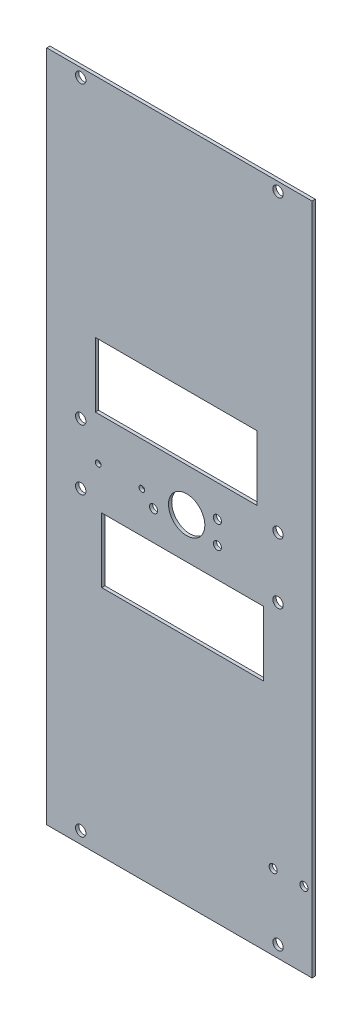
ISO-10303-21;
HEADER;
FILE_DESCRIPTION(('STEP AP214'),'2;1');
FILE_NAME('part.step','',(''),(''),'','','');
FILE_SCHEMA(('AUTOMOTIVE_DESIGN { 1 0 10303 214 1 1 1 1 }'));
ENDSEC;
DATA;
#1=APPLICATION_CONTEXT('core data for automotive mechanical design processes');
#2=APPLICATION_PROTOCOL_DEFINITION('international standard','automotive_design',2000,#1);
#3=PRODUCT_CONTEXT('',#1,'mechanical');
#4=PRODUCT('Part','Part','',(#3));
#5=PRODUCT_RELATED_PRODUCT_CATEGORY('part','',(#4));
#6=PRODUCT_DEFINITION_FORMATION('','',#4);
#7=PRODUCT_DEFINITION_CONTEXT('part definition',#1,'design');
#8=PRODUCT_DEFINITION('design','',#6,#7);
#9=PRODUCT_DEFINITION_SHAPE('','',#8);
#10=(LENGTH_UNIT() NAMED_UNIT(*) SI_UNIT(.MILLI.,.METRE.));
#11=(NAMED_UNIT(*) PLANE_ANGLE_UNIT() SI_UNIT($,.RADIAN.));
#12=(NAMED_UNIT(*) SI_UNIT($,.STERADIAN.) SOLID_ANGLE_UNIT());
#13=UNCERTAINTY_MEASURE_WITH_UNIT(LENGTH_MEASURE(1.E-05),#10,'distance_accuracy_value','');
#14=(GEOMETRIC_REPRESENTATION_CONTEXT(3) GLOBAL_UNCERTAINTY_ASSIGNED_CONTEXT((#13)) GLOBAL_UNIT_ASSIGNED_CONTEXT((#10,
#11,#12)) REPRESENTATION_CONTEXT('',''));
#15=CARTESIAN_POINT('',(0.,0.,0.));
#16=DIRECTION('',(0.,0.,1.));
#17=DIRECTION('',(1.,0.,0.));
#18=AXIS2_PLACEMENT_3D('',#15,#16,#17);
#19=CARTESIAN_POINT('',(-41.,-104.,1.));
#20=DIRECTION('',(1.,0.,0.));
#21=DIRECTION('',(0.,0.,-1.));
#22=AXIS2_PLACEMENT_3D('',#19,#20,#21);
#23=PLANE('',#22);
#24=DIRECTION('',(0.,-1.,0.));
#25=VECTOR('',#24,1.);
#26=CARTESIAN_POINT('',(-41.,-104.,0.));
#27=LINE('',#26,#25);
#28=CARTESIAN_POINT('',(-41.,104.,0.));
#29=VERTEX_POINT('',#28);
#30=CARTESIAN_POINT('',(-41.,-104.,0.));
#31=VERTEX_POINT('',#30);
#32=EDGE_CURVE('E235',#29,#31,#27,.T.);
#33=ORIENTED_EDGE('',*,*,#32,.T.);
#34=DIRECTION('',(0.,0.,-1.));
#35=VECTOR('',#34,1.);
#36=CARTESIAN_POINT('',(-41.,-104.,1.));
#37=LINE('',#36,#35);
#38=CARTESIAN_POINT('',(-41.,-104.,1.));
#39=VERTEX_POINT('',#38);
#40=EDGE_CURVE('E11',#39,#31,#37,.T.);
#41=ORIENTED_EDGE('',*,*,#40,.F.);
#42=DIRECTION('',(0.,-1.,0.));
#43=VECTOR('',#42,1.);
#44=CARTESIAN_POINT('',(-41.,-104.,1.));
#45=LINE('',#44,#43);
#46=CARTESIAN_POINT('',(-41.,104.,1.));
#47=VERTEX_POINT('',#46);
#48=EDGE_CURVE('E236',#47,#39,#45,.T.);
#49=ORIENTED_EDGE('',*,*,#48,.F.);
#50=DIRECTION('',(0.,0.,-1.));
#51=VECTOR('',#50,1.);
#52=CARTESIAN_POINT('',(-41.,104.,1.));
#53=LINE('',#52,#51);
#54=EDGE_CURVE('E246',#47,#29,#53,.T.);
#55=ORIENTED_EDGE('',*,*,#54,.T.);
#56=EDGE_LOOP('',(#33,#41,#49,#55));
#57=FACE_BOUND('',#56,.T.);
#58=ADVANCED_FACE('F33',(#57),#23,.F.);
#59=CARTESIAN_POINT('',(41.,-104.,1.));
#60=DIRECTION('',(0.,1.,0.));
#61=DIRECTION('',(-1.,0.,0.));
#62=AXIS2_PLACEMENT_3D('',#59,#60,#61);
#63=PLANE('',#62);
#64=DIRECTION('',(1.,0.,0.));
#65=VECTOR('',#64,1.);
#66=CARTESIAN_POINT('',(41.,-104.,0.));
#67=LINE('',#66,#65);
#68=CARTESIAN_POINT('',(41.,-104.,0.));
#69=VERTEX_POINT('',#68);
#70=EDGE_CURVE('E249',#31,#69,#67,.T.);
#71=ORIENTED_EDGE('',*,*,#70,.T.);
#72=DIRECTION('',(0.,0.,-1.));
#73=VECTOR('',#72,1.);
#74=CARTESIAN_POINT('',(41.,-104.,1.));
#75=LINE('',#74,#73);
#76=CARTESIAN_POINT('',(41.,-104.,1.));
#77=VERTEX_POINT('',#76);
#78=EDGE_CURVE('E41',#77,#69,#75,.T.);
#79=ORIENTED_EDGE('',*,*,#78,.F.);
#80=DIRECTION('',(1.,0.,0.));
#81=VECTOR('',#80,1.);
#82=CARTESIAN_POINT('',(41.,-104.,1.));
#83=LINE('',#82,#81);
#84=EDGE_CURVE('E239',#39,#77,#83,.T.);
#85=ORIENTED_EDGE('',*,*,#84,.F.);
#86=ORIENTED_EDGE('',*,*,#40,.T.);
#87=EDGE_LOOP('',(#71,#79,#85,#86));
#88=FACE_BOUND('',#87,.T.);
#89=ADVANCED_FACE('F333',(#88),#63,.F.);
#90=CARTESIAN_POINT('',(41.,-104.,1.));
#91=DIRECTION('',(-1.,0.,0.));
#92=DIRECTION('',(0.,0.,1.));
#93=AXIS2_PLACEMENT_3D('',#90,#91,#92);
#94=PLANE('',#93);
#95=DIRECTION('',(0.,1.,0.));
#96=VECTOR('',#95,1.);
#97=CARTESIAN_POINT('',(41.,-104.,0.));
#98=LINE('',#97,#96);
#99=CARTESIAN_POINT('',(41.,104.,0.));
#100=VERTEX_POINT('',#99);
#101=EDGE_CURVE('E251',#69,#100,#98,.T.);
#102=ORIENTED_EDGE('',*,*,#101,.T.);
#103=DIRECTION('',(0.,0.,-1.));
#104=VECTOR('',#103,1.);
#105=CARTESIAN_POINT('',(41.,104.,1.));
#106=LINE('',#105,#104);
#107=CARTESIAN_POINT('',(41.,104.,1.));
#108=VERTEX_POINT('',#107);
#109=EDGE_CURVE('E256',#108,#100,#106,.T.);
#110=ORIENTED_EDGE('',*,*,#109,.F.);
#111=DIRECTION('',(0.,1.,0.));
#112=VECTOR('',#111,1.);
#113=CARTESIAN_POINT('',(41.,-104.,1.));
#114=LINE('',#113,#112);
#115=EDGE_CURVE('E242',#77,#108,#114,.T.);
#116=ORIENTED_EDGE('',*,*,#115,.F.);
#117=ORIENTED_EDGE('',*,*,#78,.T.);
#118=EDGE_LOOP('',(#102,#110,#116,#117));
#119=FACE_BOUND('',#118,.T.);
#120=ADVANCED_FACE('F338',(#119),#94,.F.);
#121=CARTESIAN_POINT('',(41.,104.,1.));
#122=DIRECTION('',(0.,-1.,0.));
#123=DIRECTION('',(0.,0.,-1.));
#124=AXIS2_PLACEMENT_3D('',#121,#122,#123);
#125=PLANE('',#124);
#126=DIRECTION('',(-1.,0.,0.));
#127=VECTOR('',#126,1.);
#128=CARTESIAN_POINT('',(41.,104.,0.));
#129=LINE('',#128,#127);
#130=EDGE_CURVE('E240',#100,#29,#129,.T.);
#131=ORIENTED_EDGE('',*,*,#130,.T.);
#132=ORIENTED_EDGE('',*,*,#54,.F.);
#133=DIRECTION('',(-1.,0.,0.));
#134=VECTOR('',#133,1.);
#135=CARTESIAN_POINT('',(41.,104.,1.));
#136=LINE('',#135,#134);
#137=EDGE_CURVE('E244',#108,#47,#136,.T.);
#138=ORIENTED_EDGE('',*,*,#137,.F.);
#139=ORIENTED_EDGE('',*,*,#109,.T.);
#140=EDGE_LOOP('',(#131,#132,#138,#139));
#141=FACE_BOUND('',#140,.T.);
#142=ADVANCED_FACE('F326',(#141),#125,.F.);
#143=CARTESIAN_POINT('',(0.,0.,1.));
#144=DIRECTION('',(0.,0.,1.));
#145=DIRECTION('',(1.,0.,0.));
#146=AXIS2_PLACEMENT_3D('',#143,#144,#145);
#147=PLANE('',#146);
#148=CARTESIAN_POINT('',(2.25,0.650001220002142,0.999999999999999));
#149=DIRECTION('',(0.,0.,1.));
#150=DIRECTION('',(1.,0.,0.));
#151=AXIS2_PLACEMENT_3D('',#148,#149,#150);
#152=CIRCLE('',#151,5.61483876415166);
#153=CARTESIAN_POINT('',(7.86483876415166,0.650001220002142,0.999999999999999));
#154=VERTEX_POINT('',#153);
#155=EDGE_CURVE('E678',#154,#154,#152,.T.);
#156=ORIENTED_EDGE('',*,*,#155,.F.);
#157=EDGE_LOOP('',(#156));
#158=FACE_BOUND('',#157,.T.);
#159=CARTESIAN_POINT('',(11.75,4.15000122000214,1.));
#160=DIRECTION('',(0.,0.,1.));
#161=DIRECTION('',(1.,0.,0.));
#162=AXIS2_PLACEMENT_3D('',#159,#160,#161);
#163=CIRCLE('',#162,1.25);
#164=CARTESIAN_POINT('',(13.,4.15000122000214,1.));
#165=VERTEX_POINT('',#164);
#166=EDGE_CURVE('E277',#165,#165,#163,.T.);
#167=ORIENTED_EDGE('',*,*,#166,.F.);
#168=EDGE_LOOP('',(#167));
#169=FACE_BOUND('',#168,.T.);
#170=CARTESIAN_POINT('',(11.75,-2.84999877999786,1.));
#171=DIRECTION('',(0.,0.,1.));
#172=DIRECTION('',(1.,0.,0.));
#173=AXIS2_PLACEMENT_3D('',#170,#171,#172);
#174=CIRCLE('',#173,1.25);
#175=CARTESIAN_POINT('',(13.,-2.84999877999786,1.));
#176=VERTEX_POINT('',#175);
#177=EDGE_CURVE('E267',#176,#176,#174,.T.);
#178=ORIENTED_EDGE('',*,*,#177,.F.);
#179=EDGE_LOOP('',(#178));
#180=FACE_BOUND('',#179,.T.);
#181=CARTESIAN_POINT('',(-8.,-2.84999877999786,1.));
#182=DIRECTION('',(0.,0.,1.));
#183=DIRECTION('',(1.,0.,0.));
#184=AXIS2_PLACEMENT_3D('',#181,#182,#183);
#185=CIRCLE('',#184,1.25);
#186=CARTESIAN_POINT('',(-6.75,-2.84999877999786,1.));
#187=VERTEX_POINT('',#186);
#188=EDGE_CURVE('E264',#187,#187,#185,.T.);
#189=ORIENTED_EDGE('',*,*,#188,.F.);
#190=EDGE_LOOP('',(#189));
#191=FACE_BOUND('',#190,.T.);
#192=CARTESIAN_POINT('',(-25.1,0.650000000002136,1.));
#193=DIRECTION('',(0.,0.,1.));
#194=DIRECTION('',(1.,0.,0.));
#195=AXIS2_PLACEMENT_3D('',#192,#193,#194);
#196=CIRCLE('',#195,0.874999999999987);
#197=CARTESIAN_POINT('',(-24.225,0.650000000002136,1.));
#198=VERTEX_POINT('',#197);
#199=EDGE_CURVE('E263',#198,#198,#196,.T.);
#200=ORIENTED_EDGE('',*,*,#199,.F.);
#201=EDGE_LOOP('',(#200));
#202=FACE_BOUND('',#201,.T.);
#203=CARTESIAN_POINT('',(-11.6,0.650000000002136,1.));
#204=DIRECTION('',(0.,0.,1.));
#205=DIRECTION('',(1.,0.,0.));
#206=AXIS2_PLACEMENT_3D('',#203,#204,#205);
#207=CIRCLE('',#206,0.874999999999987);
#208=CARTESIAN_POINT('',(-10.725,0.650000000002136,1.));
#209=VERTEX_POINT('',#208);
#210=EDGE_CURVE('E286',#209,#209,#207,.T.);
#211=ORIENTED_EDGE('',*,*,#210,.F.);
#212=EDGE_LOOP('',(#211));
#213=FACE_BOUND('',#212,.T.);
#214=CARTESIAN_POINT('',(28.9999999999999,-80.7027961734741,1.));
#215=DIRECTION('',(0.,0.,-1.));
#216=DIRECTION('',(-1.,0.,0.));
#217=AXIS2_PLACEMENT_3D('',#214,#215,#216);
#218=CIRCLE('',#217,1.25);
#219=CARTESIAN_POINT('',(27.7499999999999,-80.7027961734741,1.));
#220=VERTEX_POINT('',#219);
#221=EDGE_CURVE('E295',#220,#220,#218,.T.);
#222=ORIENTED_EDGE('',*,*,#221,.T.);
#223=EDGE_LOOP('',(#222));
#224=FACE_BOUND('',#223,.T.);
#225=CARTESIAN_POINT('',(38.4999999999998,-80.7027961734741,1.));
#226=DIRECTION('',(0.,0.,-1.));
#227=DIRECTION('',(-1.,0.,0.));
#228=AXIS2_PLACEMENT_3D('',#225,#226,#227);
#229=CIRCLE('',#228,1.25);
#230=CARTESIAN_POINT('',(37.2499999999998,-80.7027961734741,1.));
#231=VERTEX_POINT('',#230);
#232=EDGE_CURVE('E301',#231,#231,#229,.T.);
#233=ORIENTED_EDGE('',*,*,#232,.T.);
#234=EDGE_LOOP('',(#233));
#235=FACE_BOUND('',#234,.T.);
#236=DIRECTION('',(0.,1.,0.));
#237=VECTOR('',#236,1.);
#238=CARTESIAN_POINT('',(24.,0.,1.));
#239=LINE('',#238,#237);
#240=CARTESIAN_POINT('',(24.,14.,0.999999999999999));
#241=VERTEX_POINT('',#240);
#242=CARTESIAN_POINT('',(24.,34.,0.999999999999999));
#243=VERTEX_POINT('',#242);
#244=EDGE_CURVE('E156',#241,#243,#239,.T.);
#245=ORIENTED_EDGE('',*,*,#244,.F.);
#246=DIRECTION('',(1.,0.,0.));
#247=VECTOR('',#246,1.);
#248=CARTESIAN_POINT('',(0.,14.,1.));
#249=LINE('',#248,#247);
#250=CARTESIAN_POINT('',(-26.,14.,1.));
#251=VERTEX_POINT('',#250);
#252=EDGE_CURVE('E149',#251,#241,#249,.T.);
#253=ORIENTED_EDGE('',*,*,#252,.F.);
#254=DIRECTION('',(0.,-1.,0.));
#255=VECTOR('',#254,1.);
#256=CARTESIAN_POINT('',(-26.,0.,1.));
#257=LINE('',#256,#255);
#258=CARTESIAN_POINT('',(-26.,34.,0.999999999999999));
#259=VERTEX_POINT('',#258);
#260=EDGE_CURVE('E129',#259,#251,#257,.T.);
#261=ORIENTED_EDGE('',*,*,#260,.F.);
#262=DIRECTION('',(-1.,0.,0.));
#263=VECTOR('',#262,1.);
#264=CARTESIAN_POINT('',(0.,34.,1.));
#265=LINE('',#264,#263);
#266=EDGE_CURVE('E154',#243,#259,#265,.T.);
#267=ORIENTED_EDGE('',*,*,#266,.F.);
#268=EDGE_LOOP('',(#245,#253,#261,#267));
#269=FACE_BOUND('',#268,.T.);
#270=DIRECTION('',(0.,-1.,0.));
#271=VECTOR('',#270,1.);
#272=CARTESIAN_POINT('',(-24.,0.,1.));
#273=LINE('',#272,#271);
#274=CARTESIAN_POINT('',(-24.,-12.,0.999999999999999));
#275=VERTEX_POINT('',#274);
#276=CARTESIAN_POINT('',(-24.,-32.,0.999999999999999));
#277=VERTEX_POINT('',#276);
#278=EDGE_CURVE('E185',#275,#277,#273,.T.);
#279=ORIENTED_EDGE('',*,*,#278,.F.);
#280=DIRECTION('',(-1.,0.,0.));
#281=VECTOR('',#280,1.);
#282=CARTESIAN_POINT('',(0.,-12.,1.));
#283=LINE('',#282,#281);
#284=CARTESIAN_POINT('',(26.,-12.,1.));
#285=VERTEX_POINT('',#284);
#286=EDGE_CURVE('E172',#285,#275,#283,.T.);
#287=ORIENTED_EDGE('',*,*,#286,.F.);
#288=DIRECTION('',(0.,1.,0.));
#289=VECTOR('',#288,1.);
#290=CARTESIAN_POINT('',(26.,0.,1.));
#291=LINE('',#290,#289);
#292=CARTESIAN_POINT('',(26.,-32.,0.999999999999999));
#293=VERTEX_POINT('',#292);
#294=EDGE_CURVE('E180',#293,#285,#291,.T.);
#295=ORIENTED_EDGE('',*,*,#294,.F.);
#296=DIRECTION('',(1.,0.,0.));
#297=VECTOR('',#296,1.);
#298=CARTESIAN_POINT('',(0.,-32.,1.));
#299=LINE('',#298,#297);
#300=EDGE_CURVE('E183',#277,#293,#299,.T.);
#301=ORIENTED_EDGE('',*,*,#300,.F.);
#302=EDGE_LOOP('',(#279,#287,#295,#301));
#303=FACE_BOUND('',#302,.T.);
#304=CARTESIAN_POINT('',(-30.4999999999936,9.99999999999958,1.));
#305=DIRECTION('',(0.,0.,1.));
#306=DIRECTION('',(1.,0.,0.));
#307=AXIS2_PLACEMENT_3D('',#304,#305,#306);
#308=CIRCLE('',#307,1.6);
#309=CARTESIAN_POINT('',(-28.8999999999936,9.99999999999958,1.));
#310=VERTEX_POINT('',#309);
#311=EDGE_CURVE('E187',#310,#310,#308,.T.);
#312=ORIENTED_EDGE('',*,*,#311,.F.);
#313=EDGE_LOOP('',(#312));
#314=FACE_BOUND('',#313,.T.);
#315=CARTESIAN_POINT('',(30.5000000000064,9.99999999999983,1.));
#316=DIRECTION('',(0.,0.,1.));
#317=DIRECTION('',(1.,0.,0.));
#318=AXIS2_PLACEMENT_3D('',#315,#316,#317);
#319=CIRCLE('',#318,1.6);
#320=CARTESIAN_POINT('',(32.1000000000064,9.99999999999983,1.));
#321=VERTEX_POINT('',#320);
#322=EDGE_CURVE('E193',#321,#321,#319,.T.);
#323=ORIENTED_EDGE('',*,*,#322,.F.);
#324=EDGE_LOOP('',(#323));
#325=FACE_BOUND('',#324,.T.);
#326=CARTESIAN_POINT('',(30.4999974600213,-100.299999679998,1.));
#327=DIRECTION('',(0.,0.,1.));
#328=DIRECTION('',(1.,0.,0.));
#329=AXIS2_PLACEMENT_3D('',#326,#327,#328);
#330=CIRCLE('',#329,1.6);
#331=CARTESIAN_POINT('',(32.0999974600213,-100.299999679998,1.));
#332=VERTEX_POINT('',#331);
#333=EDGE_CURVE('E199',#332,#332,#330,.T.);
#334=ORIENTED_EDGE('',*,*,#333,.F.);
#335=EDGE_LOOP('',(#334));
#336=FACE_BOUND('',#335,.T.);
#337=CARTESIAN_POINT('',(-30.5000024599787,-100.299999679998,1.));
#338=DIRECTION('',(0.,0.,1.));
#339=DIRECTION('',(1.,0.,0.));
#340=AXIS2_PLACEMENT_3D('',#337,#338,#339);
#341=CIRCLE('',#340,1.6);
#342=CARTESIAN_POINT('',(-28.9000024599787,-100.299999679998,1.));
#343=VERTEX_POINT('',#342);
#344=EDGE_CURVE('E205',#343,#343,#341,.T.);
#345=ORIENTED_EDGE('',*,*,#344,.F.);
#346=EDGE_LOOP('',(#345));
#347=FACE_BOUND('',#346,.T.);
#348=CARTESIAN_POINT('',(-30.4999999999793,101.300000000002,1.));
#349=DIRECTION('',(0.,0.,1.));
#350=DIRECTION('',(1.,0.,0.));
#351=AXIS2_PLACEMENT_3D('',#348,#349,#350);
#352=CIRCLE('',#351,1.6);
#353=CARTESIAN_POINT('',(-28.8999999999793,101.300000000002,1.));
#354=VERTEX_POINT('',#353);
#355=EDGE_CURVE('E211',#354,#354,#352,.T.);
#356=ORIENTED_EDGE('',*,*,#355,.F.);
#357=EDGE_LOOP('',(#356));
#358=FACE_BOUND('',#357,.T.);
#359=CARTESIAN_POINT('',(30.5000000000207,101.300000000003,1.));
#360=DIRECTION('',(0.,0.,1.));
#361=DIRECTION('',(1.,0.,0.));
#362=AXIS2_PLACEMENT_3D('',#359,#360,#361);
#363=CIRCLE('',#362,1.6);
#364=CARTESIAN_POINT('',(32.1000000000207,101.300000000003,1.));
#365=VERTEX_POINT('',#364);
#366=EDGE_CURVE('E217',#365,#365,#363,.T.);
#367=ORIENTED_EDGE('',*,*,#366,.F.);
#368=EDGE_LOOP('',(#367));
#369=FACE_BOUND('',#368,.T.);
#370=CARTESIAN_POINT('',(30.4999974600213,-8.69999999999785,1.));
#371=DIRECTION('',(0.,0.,1.));
#372=DIRECTION('',(1.,0.,0.));
#373=AXIS2_PLACEMENT_3D('',#370,#371,#372);
#374=CIRCLE('',#373,1.6);
#375=CARTESIAN_POINT('',(32.0999974600213,-8.69999999999785,1.));
#376=VERTEX_POINT('',#375);
#377=EDGE_CURVE('E223',#376,#376,#374,.T.);
#378=ORIENTED_EDGE('',*,*,#377,.F.);
#379=EDGE_LOOP('',(#378));
#380=FACE_BOUND('',#379,.T.);
#381=CARTESIAN_POINT('',(-30.5000024599787,-8.69999999999784,1.));
#382=DIRECTION('',(0.,0.,1.));
#383=DIRECTION('',(1.,0.,0.));
#384=AXIS2_PLACEMENT_3D('',#381,#382,#383);
#385=CIRCLE('',#384,1.6);
#386=CARTESIAN_POINT('',(-28.9000024599787,-8.69999999999784,1.));
#387=VERTEX_POINT('',#386);
#388=EDGE_CURVE('E229',#387,#387,#385,.T.);
#389=ORIENTED_EDGE('',*,*,#388,.F.);
#390=EDGE_LOOP('',(#389));
#391=FACE_BOUND('',#390,.T.);
#392=ORIENTED_EDGE('',*,*,#48,.T.);
#393=ORIENTED_EDGE('',*,*,#84,.T.);
#394=ORIENTED_EDGE('',*,*,#115,.T.);
#395=ORIENTED_EDGE('',*,*,#137,.T.);
#396=EDGE_LOOP('',(#392,#393,#394,#395));
#397=FACE_BOUND('',#396,.T.);
#398=ADVANCED_FACE('F305',(#158,#169,#180,#191,#202,#213,#224,#235,#269,#303,#314,#325,#336,
#347,#358,#369,#380,#391,#397),#147,.T.);
#399=CARTESIAN_POINT('',(0.,0.,0.));
#400=DIRECTION('',(0.,0.,1.));
#401=DIRECTION('',(1.,0.,0.));
#402=AXIS2_PLACEMENT_3D('',#399,#400,#401);
#403=PLANE('',#402);
#404=CARTESIAN_POINT('',(2.25,0.650001220002142,0.));
#405=DIRECTION('',(0.,0.,-1.));
#406=DIRECTION('',(-1.,0.,0.));
#407=AXIS2_PLACEMENT_3D('',#404,#405,#406);
#408=CIRCLE('',#407,5.61483876415166);
#409=CARTESIAN_POINT('',(-3.36483876415166,0.650001220002142,0.));
#410=VERTEX_POINT('',#409);
#411=EDGE_CURVE('E680',#410,#410,#408,.T.);
#412=ORIENTED_EDGE('',*,*,#411,.F.);
#413=EDGE_LOOP('',(#412));
#414=FACE_BOUND('',#413,.T.);
#415=CARTESIAN_POINT('',(11.75,4.15000122000214,0.));
#416=DIRECTION('',(0.,0.,1.));
#417=DIRECTION('',(1.,0.,0.));
#418=AXIS2_PLACEMENT_3D('',#415,#416,#417);
#419=CIRCLE('',#418,1.25);
#420=CARTESIAN_POINT('',(13.,4.15000122000214,0.));
#421=VERTEX_POINT('',#420);
#422=EDGE_CURVE('E36',#421,#421,#419,.T.);
#423=ORIENTED_EDGE('',*,*,#422,.T.);
#424=EDGE_LOOP('',(#423));
#425=FACE_BOUND('',#424,.T.);
#426=CARTESIAN_POINT('',(11.75,-2.84999877999786,0.));
#427=DIRECTION('',(0.,0.,1.));
#428=DIRECTION('',(1.,0.,0.));
#429=AXIS2_PLACEMENT_3D('',#426,#427,#428);
#430=CIRCLE('',#429,1.25);
#431=CARTESIAN_POINT('',(13.,-2.84999877999786,0.));
#432=VERTEX_POINT('',#431);
#433=EDGE_CURVE('E265',#432,#432,#430,.T.);
#434=ORIENTED_EDGE('',*,*,#433,.T.);
#435=EDGE_LOOP('',(#434));
#436=FACE_BOUND('',#435,.T.);
#437=CARTESIAN_POINT('',(-8.,-2.84999877999786,0.));
#438=DIRECTION('',(0.,0.,1.));
#439=DIRECTION('',(1.,0.,0.));
#440=AXIS2_PLACEMENT_3D('',#437,#438,#439);
#441=CIRCLE('',#440,1.25);
#442=CARTESIAN_POINT('',(-6.75,-2.84999877999786,0.));
#443=VERTEX_POINT('',#442);
#444=EDGE_CURVE('E261',#443,#443,#441,.T.);
#445=ORIENTED_EDGE('',*,*,#444,.T.);
#446=EDGE_LOOP('',(#445));
#447=FACE_BOUND('',#446,.T.);
#448=CARTESIAN_POINT('',(-25.1,0.650000000002136,0.));
#449=DIRECTION('',(0.,0.,1.));
#450=DIRECTION('',(1.,0.,0.));
#451=AXIS2_PLACEMENT_3D('',#448,#449,#450);
#452=CIRCLE('',#451,0.874999999999997);
#453=CARTESIAN_POINT('',(-24.225,0.650000000002136,0.));
#454=VERTEX_POINT('',#453);
#455=EDGE_CURVE('E283',#454,#454,#452,.T.);
#456=ORIENTED_EDGE('',*,*,#455,.T.);
#457=EDGE_LOOP('',(#456));
#458=FACE_BOUND('',#457,.T.);
#459=CARTESIAN_POINT('',(-11.6,0.650000000002136,0.));
#460=DIRECTION('',(0.,0.,1.));
#461=DIRECTION('',(1.,0.,0.));
#462=AXIS2_PLACEMENT_3D('',#459,#460,#461);
#463=CIRCLE('',#462,0.874999999999999);
#464=CARTESIAN_POINT('',(-10.725,0.650000000002136,0.));
#465=VERTEX_POINT('',#464);
#466=EDGE_CURVE('E289',#465,#465,#463,.T.);
#467=ORIENTED_EDGE('',*,*,#466,.T.);
#468=EDGE_LOOP('',(#467));
#469=FACE_BOUND('',#468,.T.);
#470=CARTESIAN_POINT('',(28.9999999999999,-80.7027961734741,0.));
#471=DIRECTION('',(0.,0.,-1.));
#472=DIRECTION('',(-1.,0.,0.));
#473=AXIS2_PLACEMENT_3D('',#470,#471,#472);
#474=CIRCLE('',#473,1.25);
#475=CARTESIAN_POINT('',(27.7499999999999,-80.7027961734741,0.));
#476=VERTEX_POINT('',#475);
#477=EDGE_CURVE('E292',#476,#476,#474,.T.);
#478=ORIENTED_EDGE('',*,*,#477,.F.);
#479=EDGE_LOOP('',(#478));
#480=FACE_BOUND('',#479,.T.);
#481=CARTESIAN_POINT('',(38.4999999999998,-80.7027961734741,0.));
#482=DIRECTION('',(0.,0.,-1.));
#483=DIRECTION('',(-1.,0.,0.));
#484=AXIS2_PLACEMENT_3D('',#481,#482,#483);
#485=CIRCLE('',#484,1.25);
#486=CARTESIAN_POINT('',(37.2499999999998,-80.7027961734741,0.));
#487=VERTEX_POINT('',#486);
#488=EDGE_CURVE('E298',#487,#487,#485,.T.);
#489=ORIENTED_EDGE('',*,*,#488,.F.);
#490=EDGE_LOOP('',(#489));
#491=FACE_BOUND('',#490,.T.);
#492=DIRECTION('',(-1.,0.,0.));
#493=VECTOR('',#492,1.);
#494=CARTESIAN_POINT('',(24.,14.,0.));
#495=LINE('',#494,#493);
#496=CARTESIAN_POINT('',(24.,14.,0.));
#497=VERTEX_POINT('',#496);
#498=CARTESIAN_POINT('',(-26.,14.,0.));
#499=VERTEX_POINT('',#498);
#500=EDGE_CURVE('E135',#497,#499,#495,.T.);
#501=ORIENTED_EDGE('',*,*,#500,.F.);
#502=DIRECTION('',(0.,-1.,0.));
#503=VECTOR('',#502,1.);
#504=CARTESIAN_POINT('',(24.,14.,0.));
#505=LINE('',#504,#503);
#506=CARTESIAN_POINT('',(24.,34.,0.));
#507=VERTEX_POINT('',#506);
#508=EDGE_CURVE('E57',#507,#497,#505,.T.);
#509=ORIENTED_EDGE('',*,*,#508,.F.);
#510=DIRECTION('',(1.,0.,0.));
#511=VECTOR('',#510,1.);
#512=CARTESIAN_POINT('',(24.,34.,0.));
#513=LINE('',#512,#511);
#514=CARTESIAN_POINT('',(-26.,34.,0.));
#515=VERTEX_POINT('',#514);
#516=EDGE_CURVE('E142',#515,#507,#513,.T.);
#517=ORIENTED_EDGE('',*,*,#516,.F.);
#518=DIRECTION('',(0.,1.,0.));
#519=VECTOR('',#518,1.);
#520=CARTESIAN_POINT('',(-26.,14.,0.));
#521=LINE('',#520,#519);
#522=EDGE_CURVE('E126',#499,#515,#521,.T.);
#523=ORIENTED_EDGE('',*,*,#522,.F.);
#524=EDGE_LOOP('',(#501,#509,#517,#523));
#525=FACE_BOUND('',#524,.T.);
#526=DIRECTION('',(1.,0.,0.));
#527=VECTOR('',#526,1.);
#528=CARTESIAN_POINT('',(-24.,-12.,0.));
#529=LINE('',#528,#527);
#530=CARTESIAN_POINT('',(-24.,-12.,0.));
#531=VERTEX_POINT('',#530);
#532=CARTESIAN_POINT('',(26.,-12.,0.));
#533=VERTEX_POINT('',#532);
#534=EDGE_CURVE('E160',#531,#533,#529,.T.);
#535=ORIENTED_EDGE('',*,*,#534,.F.);
#536=DIRECTION('',(0.,1.,0.));
#537=VECTOR('',#536,1.);
#538=CARTESIAN_POINT('',(-24.,-12.,0.));
#539=LINE('',#538,#537);
#540=CARTESIAN_POINT('',(-24.,-32.,0.));
#541=VERTEX_POINT('',#540);
#542=EDGE_CURVE('E158',#541,#531,#539,.T.);
#543=ORIENTED_EDGE('',*,*,#542,.F.);
#544=DIRECTION('',(-1.,0.,0.));
#545=VECTOR('',#544,1.);
#546=CARTESIAN_POINT('',(-24.,-32.,0.));
#547=LINE('',#546,#545);
#548=CARTESIAN_POINT('',(26.,-32.,0.));
#549=VERTEX_POINT('',#548);
#550=EDGE_CURVE('E166',#549,#541,#547,.T.);
#551=ORIENTED_EDGE('',*,*,#550,.F.);
#552=DIRECTION('',(0.,-1.,0.));
#553=VECTOR('',#552,1.);
#554=CARTESIAN_POINT('',(26.,-12.,0.));
#555=LINE('',#554,#553);
#556=EDGE_CURVE('E163',#533,#549,#555,.T.);
#557=ORIENTED_EDGE('',*,*,#556,.F.);
#558=EDGE_LOOP('',(#535,#543,#551,#557));
#559=FACE_BOUND('',#558,.T.);
#560=CARTESIAN_POINT('',(-30.4999999999936,9.99999999999958,0.));
#561=DIRECTION('',(0.,0.,1.));
#562=DIRECTION('',(1.,0.,0.));
#563=AXIS2_PLACEMENT_3D('',#560,#561,#562);
#564=CIRCLE('',#563,1.6);
#565=CARTESIAN_POINT('',(-28.8999999999936,9.99999999999958,0.));
#566=VERTEX_POINT('',#565);
#567=EDGE_CURVE('E190',#566,#566,#564,.T.);
#568=ORIENTED_EDGE('',*,*,#567,.T.);
#569=EDGE_LOOP('',(#568));
#570=FACE_BOUND('',#569,.T.);
#571=CARTESIAN_POINT('',(30.5000000000064,9.99999999999983,0.));
#572=DIRECTION('',(0.,0.,1.));
#573=DIRECTION('',(1.,0.,0.));
#574=AXIS2_PLACEMENT_3D('',#571,#572,#573);
#575=CIRCLE('',#574,1.6);
#576=CARTESIAN_POINT('',(32.1000000000064,9.99999999999983,0.));
#577=VERTEX_POINT('',#576);
#578=EDGE_CURVE('E196',#577,#577,#575,.T.);
#579=ORIENTED_EDGE('',*,*,#578,.T.);
#580=EDGE_LOOP('',(#579));
#581=FACE_BOUND('',#580,.T.);
#582=CARTESIAN_POINT('',(30.4999974600213,-100.299999679998,0.));
#583=DIRECTION('',(0.,0.,1.));
#584=DIRECTION('',(1.,0.,0.));
#585=AXIS2_PLACEMENT_3D('',#582,#583,#584);
#586=CIRCLE('',#585,1.6);
#587=CARTESIAN_POINT('',(32.0999974600213,-100.299999679998,0.));
#588=VERTEX_POINT('',#587);
#589=EDGE_CURVE('E202',#588,#588,#586,.T.);
#590=ORIENTED_EDGE('',*,*,#589,.T.);
#591=EDGE_LOOP('',(#590));
#592=FACE_BOUND('',#591,.T.);
#593=CARTESIAN_POINT('',(-30.5000024599787,-100.299999679998,0.));
#594=DIRECTION('',(0.,0.,1.));
#595=DIRECTION('',(1.,0.,0.));
#596=AXIS2_PLACEMENT_3D('',#593,#594,#595);
#597=CIRCLE('',#596,1.6);
#598=CARTESIAN_POINT('',(-28.9000024599787,-100.299999679998,0.));
#599=VERTEX_POINT('',#598);
#600=EDGE_CURVE('E208',#599,#599,#597,.T.);
#601=ORIENTED_EDGE('',*,*,#600,.T.);
#602=EDGE_LOOP('',(#601));
#603=FACE_BOUND('',#602,.T.);
#604=CARTESIAN_POINT('',(-30.4999999999793,101.300000000002,0.));
#605=DIRECTION('',(0.,0.,1.));
#606=DIRECTION('',(1.,0.,0.));
#607=AXIS2_PLACEMENT_3D('',#604,#605,#606);
#608=CIRCLE('',#607,1.6);
#609=CARTESIAN_POINT('',(-28.8999999999793,101.300000000002,0.));
#610=VERTEX_POINT('',#609);
#611=EDGE_CURVE('E214',#610,#610,#608,.T.);
#612=ORIENTED_EDGE('',*,*,#611,.T.);
#613=EDGE_LOOP('',(#612));
#614=FACE_BOUND('',#613,.T.);
#615=CARTESIAN_POINT('',(30.5000000000207,101.300000000003,0.));
#616=DIRECTION('',(0.,0.,1.));
#617=DIRECTION('',(1.,0.,0.));
#618=AXIS2_PLACEMENT_3D('',#615,#616,#617);
#619=CIRCLE('',#618,1.6);
#620=CARTESIAN_POINT('',(32.1000000000207,101.300000000003,0.));
#621=VERTEX_POINT('',#620);
#622=EDGE_CURVE('E220',#621,#621,#619,.T.);
#623=ORIENTED_EDGE('',*,*,#622,.T.);
#624=EDGE_LOOP('',(#623));
#625=FACE_BOUND('',#624,.T.);
#626=CARTESIAN_POINT('',(30.4999974600213,-8.69999999999785,0.));
#627=DIRECTION('',(0.,0.,1.));
#628=DIRECTION('',(1.,0.,0.));
#629=AXIS2_PLACEMENT_3D('',#626,#627,#628);
#630=CIRCLE('',#629,1.6);
#631=CARTESIAN_POINT('',(32.0999974600213,-8.69999999999785,0.));
#632=VERTEX_POINT('',#631);
#633=EDGE_CURVE('E226',#632,#632,#630,.T.);
#634=ORIENTED_EDGE('',*,*,#633,.T.);
#635=EDGE_LOOP('',(#634));
#636=FACE_BOUND('',#635,.T.);
#637=CARTESIAN_POINT('',(-30.5000024599787,-8.69999999999784,0.));
#638=DIRECTION('',(0.,0.,1.));
#639=DIRECTION('',(1.,0.,0.));
#640=AXIS2_PLACEMENT_3D('',#637,#638,#639);
#641=CIRCLE('',#640,1.6);
#642=CARTESIAN_POINT('',(-28.9000024599787,-8.69999999999784,0.));
#643=VERTEX_POINT('',#642);
#644=EDGE_CURVE('E232',#643,#643,#641,.T.);
#645=ORIENTED_EDGE('',*,*,#644,.T.);
#646=EDGE_LOOP('',(#645));
#647=FACE_BOUND('',#646,.T.);
#648=ORIENTED_EDGE('',*,*,#32,.F.);
#649=ORIENTED_EDGE('',*,*,#130,.F.);
#650=ORIENTED_EDGE('',*,*,#101,.F.);
#651=ORIENTED_EDGE('',*,*,#70,.F.);
#652=EDGE_LOOP('',(#648,#649,#650,#651));
#653=FACE_BOUND('',#652,.T.);
#654=ADVANCED_FACE('F139',(#414,#425,#436,#447,#458,#469,#480,#491,#525,#559,#570,#581,#592,
#603,#614,#625,#636,#647,#653),#403,.F.);
#655=CARTESIAN_POINT('',(-30.5000024599787,-8.69999999999784,1.));
#656=DIRECTION('',(0.,0.,1.));
#657=DIRECTION('',(1.,0.,0.));
#658=AXIS2_PLACEMENT_3D('',#655,#656,#657);
#659=CYLINDRICAL_SURFACE('',#658,1.6);
#660=ORIENTED_EDGE('',*,*,#644,.F.);
#661=EDGE_LOOP('',(#660));
#662=FACE_BOUND('',#661,.T.);
#663=ORIENTED_EDGE('',*,*,#388,.T.);
#664=EDGE_LOOP('',(#663));
#665=FACE_BOUND('',#664,.T.);
#666=ADVANCED_FACE('F316',(#662,#665),#659,.F.);
#667=CARTESIAN_POINT('',(30.4999974600213,-8.69999999999785,1.));
#668=DIRECTION('',(0.,0.,1.));
#669=DIRECTION('',(1.,0.,0.));
#670=AXIS2_PLACEMENT_3D('',#667,#668,#669);
#671=CYLINDRICAL_SURFACE('',#670,1.6);
#672=ORIENTED_EDGE('',*,*,#633,.F.);
#673=EDGE_LOOP('',(#672));
#674=FACE_BOUND('',#673,.T.);
#675=ORIENTED_EDGE('',*,*,#377,.T.);
#676=EDGE_LOOP('',(#675));
#677=FACE_BOUND('',#676,.T.);
#678=ADVANCED_FACE('F323',(#674,#677),#671,.F.);
#679=CARTESIAN_POINT('',(30.5000000000207,101.300000000003,1.));
#680=DIRECTION('',(0.,0.,1.));
#681=DIRECTION('',(1.,0.,0.));
#682=AXIS2_PLACEMENT_3D('',#679,#680,#681);
#683=CYLINDRICAL_SURFACE('',#682,1.6);
#684=ORIENTED_EDGE('',*,*,#622,.F.);
#685=EDGE_LOOP('',(#684));
#686=FACE_BOUND('',#685,.T.);
#687=ORIENTED_EDGE('',*,*,#366,.T.);
#688=EDGE_LOOP('',(#687));
#689=FACE_BOUND('',#688,.T.);
#690=ADVANCED_FACE('F531',(#686,#689),#683,.F.);
#691=CARTESIAN_POINT('',(-30.4999999999793,101.300000000002,1.));
#692=DIRECTION('',(0.,0.,1.));
#693=DIRECTION('',(1.,0.,0.));
#694=AXIS2_PLACEMENT_3D('',#691,#692,#693);
#695=CYLINDRICAL_SURFACE('',#694,1.6);
#696=ORIENTED_EDGE('',*,*,#611,.F.);
#697=EDGE_LOOP('',(#696));
#698=FACE_BOUND('',#697,.T.);
#699=ORIENTED_EDGE('',*,*,#355,.T.);
#700=EDGE_LOOP('',(#699));
#701=FACE_BOUND('',#700,.T.);
#702=ADVANCED_FACE('F523',(#698,#701),#695,.F.);
#703=CARTESIAN_POINT('',(-30.5000024599787,-100.299999679998,1.));
#704=DIRECTION('',(0.,0.,1.));
#705=DIRECTION('',(1.,0.,0.));
#706=AXIS2_PLACEMENT_3D('',#703,#704,#705);
#707=CYLINDRICAL_SURFACE('',#706,1.6);
#708=ORIENTED_EDGE('',*,*,#600,.F.);
#709=EDGE_LOOP('',(#708));
#710=FACE_BOUND('',#709,.T.);
#711=ORIENTED_EDGE('',*,*,#344,.T.);
#712=EDGE_LOOP('',(#711));
#713=FACE_BOUND('',#712,.T.);
#714=ADVANCED_FACE('F515',(#710,#713),#707,.F.);
#715=CARTESIAN_POINT('',(30.4999974600213,-100.299999679998,1.));
#716=DIRECTION('',(0.,0.,1.));
#717=DIRECTION('',(1.,0.,0.));
#718=AXIS2_PLACEMENT_3D('',#715,#716,#717);
#719=CYLINDRICAL_SURFACE('',#718,1.6);
#720=ORIENTED_EDGE('',*,*,#589,.F.);
#721=EDGE_LOOP('',(#720));
#722=FACE_BOUND('',#721,.T.);
#723=ORIENTED_EDGE('',*,*,#333,.T.);
#724=EDGE_LOOP('',(#723));
#725=FACE_BOUND('',#724,.T.);
#726=ADVANCED_FACE('F507',(#722,#725),#719,.F.);
#727=CARTESIAN_POINT('',(30.5000000000064,9.99999999999983,1.));
#728=DIRECTION('',(0.,0.,1.));
#729=DIRECTION('',(1.,0.,0.));
#730=AXIS2_PLACEMENT_3D('',#727,#728,#729);
#731=CYLINDRICAL_SURFACE('',#730,1.6);
#732=ORIENTED_EDGE('',*,*,#578,.F.);
#733=EDGE_LOOP('',(#732));
#734=FACE_BOUND('',#733,.T.);
#735=ORIENTED_EDGE('',*,*,#322,.T.);
#736=EDGE_LOOP('',(#735));
#737=FACE_BOUND('',#736,.T.);
#738=ADVANCED_FACE('F499',(#734,#737),#731,.F.);
#739=CARTESIAN_POINT('',(-30.4999999999936,9.99999999999958,1.));
#740=DIRECTION('',(0.,0.,1.));
#741=DIRECTION('',(1.,0.,0.));
#742=AXIS2_PLACEMENT_3D('',#739,#740,#741);
#743=CYLINDRICAL_SURFACE('',#742,1.6);
#744=ORIENTED_EDGE('',*,*,#567,.F.);
#745=EDGE_LOOP('',(#744));
#746=FACE_BOUND('',#745,.T.);
#747=ORIENTED_EDGE('',*,*,#311,.T.);
#748=EDGE_LOOP('',(#747));
#749=FACE_BOUND('',#748,.T.);
#750=ADVANCED_FACE('F491',(#746,#749),#743,.F.);
#751=CARTESIAN_POINT('',(-24.,-12.,10.));
#752=DIRECTION('',(-1.,0.,0.));
#753=DIRECTION('',(0.,-1.,0.));
#754=AXIS2_PLACEMENT_3D('',#751,#752,#753);
#755=PLANE('',#754);
#756=ORIENTED_EDGE('',*,*,#278,.T.);
#757=DIRECTION('',(0.,0.,-1.));
#758=VECTOR('',#757,1.);
#759=CARTESIAN_POINT('',(-24.,-32.,10.));
#760=LINE('',#759,#758);
#761=EDGE_CURVE('E170',#277,#541,#760,.T.);
#762=ORIENTED_EDGE('',*,*,#761,.T.);
#763=ORIENTED_EDGE('',*,*,#542,.T.);
#764=DIRECTION('',(0.,0.,-1.));
#765=VECTOR('',#764,1.);
#766=CARTESIAN_POINT('',(-24.,-12.,10.));
#767=LINE('',#766,#765);
#768=EDGE_CURVE('E169',#275,#531,#767,.T.);
#769=ORIENTED_EDGE('',*,*,#768,.F.);
#770=EDGE_LOOP('',(#756,#762,#763,#769));
#771=FACE_BOUND('',#770,.T.);
#772=ADVANCED_FACE('F483',(#771),#755,.F.);
#773=CARTESIAN_POINT('',(-24.,-32.,10.));
#774=DIRECTION('',(0.,-1.,0.));
#775=DIRECTION('',(0.,0.,-1.));
#776=AXIS2_PLACEMENT_3D('',#773,#774,#775);
#777=PLANE('',#776);
#778=ORIENTED_EDGE('',*,*,#300,.T.);
#779=DIRECTION('',(0.,0.,-1.));
#780=VECTOR('',#779,1.);
#781=CARTESIAN_POINT('',(26.,-32.,10.));
#782=LINE('',#781,#780);
#783=EDGE_CURVE('E173',#293,#549,#782,.T.);
#784=ORIENTED_EDGE('',*,*,#783,.T.);
#785=ORIENTED_EDGE('',*,*,#550,.T.);
#786=ORIENTED_EDGE('',*,*,#761,.F.);
#787=EDGE_LOOP('',(#778,#784,#785,#786));
#788=FACE_BOUND('',#787,.T.);
#789=ADVANCED_FACE('F475',(#788),#777,.F.);
#790=CARTESIAN_POINT('',(26.,-12.,10.));
#791=DIRECTION('',(1.,0.,0.));
#792=DIRECTION('',(0.,1.,0.));
#793=AXIS2_PLACEMENT_3D('',#790,#791,#792);
#794=PLANE('',#793);
#795=ORIENTED_EDGE('',*,*,#294,.T.);
#796=DIRECTION('',(0.,0.,-1.));
#797=VECTOR('',#796,1.);
#798=CARTESIAN_POINT('',(26.,-12.,10.));
#799=LINE('',#798,#797);
#800=EDGE_CURVE('E175',#285,#533,#799,.T.);
#801=ORIENTED_EDGE('',*,*,#800,.T.);
#802=ORIENTED_EDGE('',*,*,#556,.T.);
#803=ORIENTED_EDGE('',*,*,#783,.F.);
#804=EDGE_LOOP('',(#795,#801,#802,#803));
#805=FACE_BOUND('',#804,.T.);
#806=ADVANCED_FACE('F467',(#805),#794,.F.);
#807=CARTESIAN_POINT('',(-24.,-12.,10.));
#808=DIRECTION('',(0.,1.,0.));
#809=DIRECTION('',(-1.,0.,0.));
#810=AXIS2_PLACEMENT_3D('',#807,#808,#809);
#811=PLANE('',#810);
#812=ORIENTED_EDGE('',*,*,#286,.T.);
#813=ORIENTED_EDGE('',*,*,#768,.T.);
#814=ORIENTED_EDGE('',*,*,#534,.T.);
#815=ORIENTED_EDGE('',*,*,#800,.F.);
#816=EDGE_LOOP('',(#812,#813,#814,#815));
#817=FACE_BOUND('',#816,.T.);
#818=ADVANCED_FACE('F460',(#817),#811,.F.);
#819=CARTESIAN_POINT('',(24.,14.,10.));
#820=DIRECTION('',(1.,0.,0.));
#821=DIRECTION('',(0.,0.,-1.));
#822=AXIS2_PLACEMENT_3D('',#819,#820,#821);
#823=PLANE('',#822);
#824=ORIENTED_EDGE('',*,*,#244,.T.);
#825=DIRECTION('',(0.,0.,-1.));
#826=VECTOR('',#825,1.);
#827=CARTESIAN_POINT('',(24.,34.,10.));
#828=LINE('',#827,#826);
#829=EDGE_CURVE('E147',#243,#507,#828,.T.);
#830=ORIENTED_EDGE('',*,*,#829,.T.);
#831=ORIENTED_EDGE('',*,*,#508,.T.);
#832=DIRECTION('',(0.,0.,-1.));
#833=VECTOR('',#832,1.);
#834=CARTESIAN_POINT('',(24.,14.,10.));
#835=LINE('',#834,#833);
#836=EDGE_CURVE('E132',#241,#497,#835,.T.);
#837=ORIENTED_EDGE('',*,*,#836,.F.);
#838=EDGE_LOOP('',(#824,#830,#831,#837));
#839=FACE_BOUND('',#838,.T.);
#840=ADVANCED_FACE('F452',(#839),#823,.F.);
#841=CARTESIAN_POINT('',(24.,34.,10.));
#842=DIRECTION('',(0.,1.,0.));
#843=DIRECTION('',(0.,0.,1.));
#844=AXIS2_PLACEMENT_3D('',#841,#842,#843);
#845=PLANE('',#844);
#846=ORIENTED_EDGE('',*,*,#266,.T.);
#847=DIRECTION('',(0.,0.,-1.));
#848=VECTOR('',#847,1.);
#849=CARTESIAN_POINT('',(-26.,34.,10.));
#850=LINE('',#849,#848);
#851=EDGE_CURVE('E131',#259,#515,#850,.T.);
#852=ORIENTED_EDGE('',*,*,#851,.T.);
#853=ORIENTED_EDGE('',*,*,#516,.T.);
#854=ORIENTED_EDGE('',*,*,#829,.F.);
#855=EDGE_LOOP('',(#846,#852,#853,#854));
#856=FACE_BOUND('',#855,.T.);
#857=ADVANCED_FACE('F445',(#856),#845,.F.);
#858=CARTESIAN_POINT('',(-26.,14.,10.));
#859=DIRECTION('',(-1.,0.,0.));
#860=DIRECTION('',(0.,0.,1.));
#861=AXIS2_PLACEMENT_3D('',#858,#859,#860);
#862=PLANE('',#861);
#863=ORIENTED_EDGE('',*,*,#260,.T.);
#864=DIRECTION('',(0.,0.,-1.));
#865=VECTOR('',#864,1.);
#866=CARTESIAN_POINT('',(-26.,14.,10.));
#867=LINE('',#866,#865);
#868=EDGE_CURVE('E49',#251,#499,#867,.T.);
#869=ORIENTED_EDGE('',*,*,#868,.T.);
#870=ORIENTED_EDGE('',*,*,#522,.T.);
#871=ORIENTED_EDGE('',*,*,#851,.F.);
#872=EDGE_LOOP('',(#863,#869,#870,#871));
#873=FACE_BOUND('',#872,.T.);
#874=ADVANCED_FACE('F123',(#873),#862,.F.);
#875=CARTESIAN_POINT('',(24.,14.,10.));
#876=DIRECTION('',(0.,-1.,0.));
#877=DIRECTION('',(0.,0.,-1.));
#878=AXIS2_PLACEMENT_3D('',#875,#876,#877);
#879=PLANE('',#878);
#880=ORIENTED_EDGE('',*,*,#252,.T.);
#881=ORIENTED_EDGE('',*,*,#836,.T.);
#882=ORIENTED_EDGE('',*,*,#500,.T.);
#883=ORIENTED_EDGE('',*,*,#868,.F.);
#884=EDGE_LOOP('',(#880,#881,#882,#883));
#885=FACE_BOUND('',#884,.T.);
#886=ADVANCED_FACE('F136',(#885),#879,.F.);
#887=CARTESIAN_POINT('',(38.4999999999998,-80.7027961734741,0.));
#888=DIRECTION('',(0.,0.,-1.));
#889=DIRECTION('',(-1.,0.,0.));
#890=AXIS2_PLACEMENT_3D('',#887,#888,#889);
#891=CYLINDRICAL_SURFACE('',#890,1.25);
#892=ORIENTED_EDGE('',*,*,#232,.F.);
#893=EDGE_LOOP('',(#892));
#894=FACE_BOUND('',#893,.T.);
#895=ORIENTED_EDGE('',*,*,#488,.T.);
#896=EDGE_LOOP('',(#895));
#897=FACE_BOUND('',#896,.T.);
#898=ADVANCED_FACE('F308',(#894,#897),#891,.F.);
#899=CARTESIAN_POINT('',(28.9999999999999,-80.7027961734741,0.));
#900=DIRECTION('',(0.,0.,-1.));
#901=DIRECTION('',(-1.,0.,0.));
#902=AXIS2_PLACEMENT_3D('',#899,#900,#901);
#903=CYLINDRICAL_SURFACE('',#902,1.25);
#904=ORIENTED_EDGE('',*,*,#221,.F.);
#905=EDGE_LOOP('',(#904));
#906=FACE_BOUND('',#905,.T.);
#907=ORIENTED_EDGE('',*,*,#477,.T.);
#908=EDGE_LOOP('',(#907));
#909=FACE_BOUND('',#908,.T.);
#910=ADVANCED_FACE('F311',(#906,#909),#903,.F.);
#911=CARTESIAN_POINT('',(-11.6,0.650000000002136,1.));
#912=DIRECTION('',(0.,0.,1.));
#913=DIRECTION('',(1.,0.,0.));
#914=AXIS2_PLACEMENT_3D('',#911,#912,#913);
#915=CYLINDRICAL_SURFACE('',#914,0.874999999999993);
#916=ORIENTED_EDGE('',*,*,#466,.F.);
#917=EDGE_LOOP('',(#916));
#918=FACE_BOUND('',#917,.T.);
#919=ORIENTED_EDGE('',*,*,#210,.T.);
#920=EDGE_LOOP('',(#919));
#921=FACE_BOUND('',#920,.T.);
#922=ADVANCED_FACE('F413',(#918,#921),#915,.F.);
#923=CARTESIAN_POINT('',(-25.1,0.650000000002136,1.));
#924=DIRECTION('',(0.,0.,1.));
#925=DIRECTION('',(1.,0.,0.));
#926=AXIS2_PLACEMENT_3D('',#923,#924,#925);
#927=CYLINDRICAL_SURFACE('',#926,0.874999999999992);
#928=ORIENTED_EDGE('',*,*,#455,.F.);
#929=EDGE_LOOP('',(#928));
#930=FACE_BOUND('',#929,.T.);
#931=ORIENTED_EDGE('',*,*,#199,.T.);
#932=EDGE_LOOP('',(#931));
#933=FACE_BOUND('',#932,.T.);
#934=ADVANCED_FACE('F405',(#930,#933),#927,.F.);
#935=CARTESIAN_POINT('',(-8.,-2.84999877999786,-9.));
#936=DIRECTION('',(0.,0.,1.));
#937=DIRECTION('',(1.,0.,0.));
#938=AXIS2_PLACEMENT_3D('',#935,#936,#937);
#939=CYLINDRICAL_SURFACE('',#938,1.25);
#940=ORIENTED_EDGE('',*,*,#188,.T.);
#941=EDGE_LOOP('',(#940));
#942=FACE_BOUND('',#941,.T.);
#943=ORIENTED_EDGE('',*,*,#444,.F.);
#944=EDGE_LOOP('',(#943));
#945=FACE_BOUND('',#944,.T.);
#946=ADVANCED_FACE('F398',(#942,#945),#939,.F.);
#947=CARTESIAN_POINT('',(11.75,-2.84999877999786,-9.));
#948=DIRECTION('',(0.,0.,1.));
#949=DIRECTION('',(1.,0.,0.));
#950=AXIS2_PLACEMENT_3D('',#947,#948,#949);
#951=CYLINDRICAL_SURFACE('',#950,1.25);
#952=ORIENTED_EDGE('',*,*,#177,.T.);
#953=EDGE_LOOP('',(#952));
#954=FACE_BOUND('',#953,.T.);
#955=ORIENTED_EDGE('',*,*,#433,.F.);
#956=EDGE_LOOP('',(#955));
#957=FACE_BOUND('',#956,.T.);
#958=ADVANCED_FACE('F393',(#954,#957),#951,.F.);
#959=CARTESIAN_POINT('',(11.75,4.15000122000214,-9.));
#960=DIRECTION('',(0.,0.,1.));
#961=DIRECTION('',(1.,0.,0.));
#962=AXIS2_PLACEMENT_3D('',#959,#960,#961);
#963=CYLINDRICAL_SURFACE('',#962,1.25);
#964=ORIENTED_EDGE('',*,*,#166,.T.);
#965=EDGE_LOOP('',(#964));
#966=FACE_BOUND('',#965,.T.);
#967=ORIENTED_EDGE('',*,*,#422,.F.);
#968=EDGE_LOOP('',(#967));
#969=FACE_BOUND('',#968,.T.);
#970=ADVANCED_FACE('F372',(#966,#969),#963,.F.);
#971=CARTESIAN_POINT('',(2.25,0.650001220002142,10.));
#972=DIRECTION('',(0.,0.,-1.));
#973=DIRECTION('',(-1.,0.,0.));
#974=AXIS2_PLACEMENT_3D('',#971,#972,#973);
#975=CYLINDRICAL_SURFACE('',#974,5.61483876415166);
#976=ORIENTED_EDGE('',*,*,#155,.T.);
#977=EDGE_LOOP('',(#976));
#978=FACE_BOUND('',#977,.T.);
#979=ORIENTED_EDGE('',*,*,#411,.T.);
#980=EDGE_LOOP('',(#979));
#981=FACE_BOUND('',#980,.T.);
#982=ADVANCED_FACE('F382',(#978,#981),#975,.F.);
#983=CLOSED_SHELL('',(#58,#89,#120,#142,#398,#654,#666,#678,#690,#702,#714,#726,#738,#750,#772,
#789,#806,#818,#840,#857,#874,#886,#898,#910,#922,#934,#946,#958,#970,#982));
#984=MANIFOLD_SOLID_BREP('B2',#983);
#985=ADVANCED_BREP_SHAPE_REPRESENTATION('',(#18,#984),#14);
#986=SHAPE_DEFINITION_REPRESENTATION(#9,#985);
ENDSEC;
END-ISO-10303-21;
